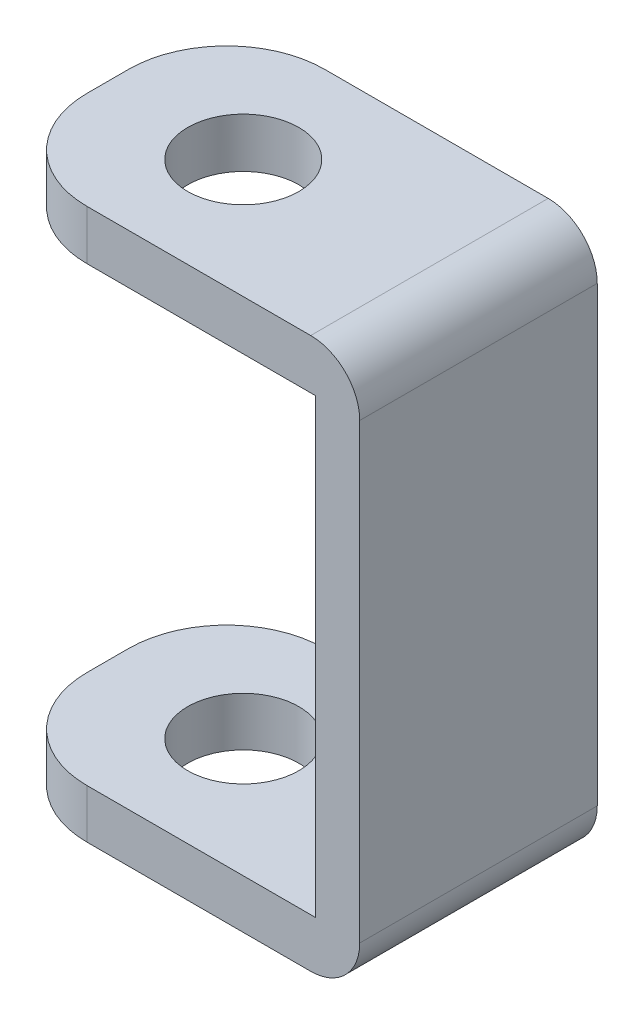
ISO-10303-21;
HEADER;
FILE_DESCRIPTION(('STEP AP214'),'2;1');
FILE_NAME('part.step','',(''),(''),'','','');
FILE_SCHEMA(('AUTOMOTIVE_DESIGN { 1 0 10303 214 1 1 1 1 }'));
ENDSEC;
DATA;
#1=APPLICATION_CONTEXT('core data for automotive mechanical design processes');
#2=APPLICATION_PROTOCOL_DEFINITION('international standard','automotive_design',2000,#1);
#3=PRODUCT_CONTEXT('',#1,'mechanical');
#4=PRODUCT('Part','Part','',(#3));
#5=PRODUCT_RELATED_PRODUCT_CATEGORY('part','',(#4));
#6=PRODUCT_DEFINITION_FORMATION('','',#4);
#7=PRODUCT_DEFINITION_CONTEXT('part definition',#1,'design');
#8=PRODUCT_DEFINITION('design','',#6,#7);
#9=PRODUCT_DEFINITION_SHAPE('','',#8);
#10=(LENGTH_UNIT() NAMED_UNIT(*) SI_UNIT(.MILLI.,.METRE.));
#11=(NAMED_UNIT(*) PLANE_ANGLE_UNIT() SI_UNIT($,.RADIAN.));
#12=(NAMED_UNIT(*) SI_UNIT($,.STERADIAN.) SOLID_ANGLE_UNIT());
#13=UNCERTAINTY_MEASURE_WITH_UNIT(LENGTH_MEASURE(1.E-05),#10,'distance_accuracy_value','');
#14=(GEOMETRIC_REPRESENTATION_CONTEXT(3) GLOBAL_UNCERTAINTY_ASSIGNED_CONTEXT((#13)) GLOBAL_UNIT_ASSIGNED_CONTEXT((#10,
#11,#12)) REPRESENTATION_CONTEXT('',''));
#15=CARTESIAN_POINT('',(0.,0.,0.));
#16=DIRECTION('',(0.,0.,1.));
#17=DIRECTION('',(1.,0.,0.));
#18=AXIS2_PLACEMENT_3D('',#15,#16,#17);
#19=CARTESIAN_POINT('',(-0.121305042169645,78.59,0.));
#20=DIRECTION('',(-1.,0.,0.));
#21=DIRECTION('',(0.,0.,1.));
#22=AXIS2_PLACEMENT_3D('',#19,#20,#21);
#23=PLANE('',#22);
#24=DIRECTION('',(0.,-1.,0.));
#25=VECTOR('',#24,1.);
#26=CARTESIAN_POINT('',(-0.121305042169645,78.59,-14.0000000000001));
#27=LINE('',#26,#25);
#28=CARTESIAN_POINT('',(-0.121305042169645,7.00000000000001,-14.0000000000001));
#29=VERTEX_POINT('',#28);
#30=CARTESIAN_POINT('',(-0.121305042169645,0.,-14.0000000000001));
#31=VERTEX_POINT('',#30);
#32=EDGE_CURVE('E236',#29,#31,#27,.T.);
#33=ORIENTED_EDGE('',*,*,#32,.F.);
#34=DIRECTION('',(0.,0.,-1.));
#35=VECTOR('',#34,1.);
#36=CARTESIAN_POINT('',(-0.121305042169645,7.00000000000001,0.));
#37=LINE('',#36,#35);
#38=CARTESIAN_POINT('',(-0.121305042169643,7.00000000000001,-19.8999999999999));
#39=VERTEX_POINT('',#38);
#40=EDGE_CURVE('E179',#29,#39,#37,.T.);
#41=ORIENTED_EDGE('',*,*,#40,.T.);
#42=DIRECTION('',(0.,-1.,0.));
#43=VECTOR('',#42,1.);
#44=CARTESIAN_POINT('',(-0.121305042169645,78.59,-19.8999999999999));
#45=LINE('',#44,#43);
#46=CARTESIAN_POINT('',(-0.121305042169645,0.,-19.8999999999999));
#47=VERTEX_POINT('',#46);
#48=EDGE_CURVE('E206',#39,#47,#45,.T.);
#49=ORIENTED_EDGE('',*,*,#48,.T.);
#50=DIRECTION('',(0.,0.,-1.));
#51=VECTOR('',#50,1.);
#52=CARTESIAN_POINT('',(-0.121305042169645,0.,0.));
#53=LINE('',#52,#51);
#54=EDGE_CURVE('E209',#31,#47,#53,.T.);
#55=ORIENTED_EDGE('',*,*,#54,.F.);
#56=EDGE_LOOP('',(#33,#41,#49,#55));
#57=FACE_BOUND('',#56,.T.);
#58=ADVANCED_FACE('F38',(#57),#23,.T.);
#59=CARTESIAN_POINT('',(-0.121305042169645,78.59,-19.8999999999999));
#60=VERTEX_POINT('',#59);
#61=CARTESIAN_POINT('',(-0.121305042169645,71.5001545213383,-19.8999999999999));
#62=VERTEX_POINT('',#61);
#63=EDGE_CURVE('E222',#60,#62,#45,.T.);
#64=ORIENTED_EDGE('',*,*,#63,.T.);
#65=DIRECTION('',(0.,0.,1.));
#66=VECTOR('',#65,1.);
#67=CARTESIAN_POINT('',(-0.121305042169645,71.5001545213383,0.));
#68=LINE('',#67,#66);
#69=CARTESIAN_POINT('',(-0.121305042169645,71.5001545213383,-14.0000000000001));
#70=VERTEX_POINT('',#69);
#71=EDGE_CURVE('E169',#62,#70,#68,.T.);
#72=ORIENTED_EDGE('',*,*,#71,.T.);
#73=CARTESIAN_POINT('',(-0.121305042169645,78.59,-14.0000000000001));
#74=VERTEX_POINT('',#73);
#75=EDGE_CURVE('E237',#74,#70,#27,.T.);
#76=ORIENTED_EDGE('',*,*,#75,.F.);
#77=DIRECTION('',(0.,0.,-1.));
#78=VECTOR('',#77,1.);
#79=CARTESIAN_POINT('',(-0.121305042169645,78.59,0.));
#80=LINE('',#79,#78);
#81=EDGE_CURVE('E190',#74,#60,#80,.T.);
#82=ORIENTED_EDGE('',*,*,#81,.T.);
#83=EDGE_LOOP('',(#64,#72,#76,#82));
#84=FACE_BOUND('',#83,.T.);
#85=ADVANCED_FACE('F286',(#84),#23,.T.);
#86=CARTESIAN_POINT('',(13.8786949578304,78.59,-14.));
#87=DIRECTION('',(0.,-1.,0.));
#88=DIRECTION('',(0.,0.,-1.));
#89=AXIS2_PLACEMENT_3D('',#86,#87,#88);
#90=CYLINDRICAL_SURFACE('',#89,14.);
#91=CARTESIAN_POINT('',(13.8786949578304,7.00000000000001,-14.));
#92=DIRECTION('',(0.,1.,0.));
#93=DIRECTION('',(0.,0.,1.));
#94=AXIS2_PLACEMENT_3D('',#91,#92,#93);
#95=CIRCLE('',#94,14.);
#96=CARTESIAN_POINT('',(13.8786949578305,7.00000000000001,0.));
#97=VERTEX_POINT('',#96);
#98=EDGE_CURVE('E157',#29,#97,#95,.T.);
#99=ORIENTED_EDGE('',*,*,#98,.F.);
#100=ORIENTED_EDGE('',*,*,#32,.T.);
#101=CARTESIAN_POINT('',(13.8786949578304,0.,-14.));
#102=DIRECTION('',(0.,1.,0.));
#103=DIRECTION('',(0.,0.,1.));
#104=AXIS2_PLACEMENT_3D('',#101,#102,#103);
#105=CIRCLE('',#104,14.);
#106=CARTESIAN_POINT('',(13.8786949578305,0.,0.));
#107=VERTEX_POINT('',#106);
#108=EDGE_CURVE('E212',#31,#107,#105,.T.);
#109=ORIENTED_EDGE('',*,*,#108,.T.);
#110=DIRECTION('',(0.,-1.,0.));
#111=VECTOR('',#110,1.);
#112=CARTESIAN_POINT('',(13.8786949578305,78.59,0.));
#113=LINE('',#112,#111);
#114=EDGE_CURVE('E233',#97,#107,#113,.T.);
#115=ORIENTED_EDGE('',*,*,#114,.F.);
#116=EDGE_LOOP('',(#99,#100,#109,#115));
#117=FACE_BOUND('',#116,.T.);
#118=ADVANCED_FACE('F268',(#117),#90,.T.);
#119=CARTESIAN_POINT('',(13.8786949578304,71.5001545213383,-14.));
#120=DIRECTION('',(0.,-1.,0.));
#121=DIRECTION('',(0.,0.,-1.));
#122=AXIS2_PLACEMENT_3D('',#119,#120,#121);
#123=CIRCLE('',#122,14.);
#124=CARTESIAN_POINT('',(13.8786949578305,71.5001545213383,0.));
#125=VERTEX_POINT('',#124);
#126=EDGE_CURVE('E172',#125,#70,#123,.T.);
#127=ORIENTED_EDGE('',*,*,#126,.F.);
#128=CARTESIAN_POINT('',(13.8786949578305,78.59,0.));
#129=VERTEX_POINT('',#128);
#130=EDGE_CURVE('E234',#129,#125,#113,.T.);
#131=ORIENTED_EDGE('',*,*,#130,.F.);
#132=CARTESIAN_POINT('',(13.8786949578304,78.59,-14.));
#133=DIRECTION('',(0.,1.,0.));
#134=DIRECTION('',(0.,0.,1.));
#135=AXIS2_PLACEMENT_3D('',#132,#133,#134);
#136=CIRCLE('',#135,14.);
#137=EDGE_CURVE('E194',#74,#129,#136,.T.);
#138=ORIENTED_EDGE('',*,*,#137,.F.);
#139=ORIENTED_EDGE('',*,*,#75,.T.);
#140=EDGE_LOOP('',(#127,#131,#138,#139));
#141=FACE_BOUND('',#140,.T.);
#142=ADVANCED_FACE('F323',(#141),#90,.T.);
#143=CARTESIAN_POINT('',(0.,78.59,0.));
#144=DIRECTION('',(0.,0.,-1.));
#145=DIRECTION('',(-1.,0.,0.));
#146=AXIS2_PLACEMENT_3D('',#143,#144,#145);
#147=PLANE('',#146);
#148=DIRECTION('',(1.,0.,0.));
#149=VECTOR('',#148,1.);
#150=CARTESIAN_POINT('',(0.,0.,0.));
#151=LINE('',#150,#149);
#152=CARTESIAN_POINT('',(45.7786949578304,0.,0.));
#153=VERTEX_POINT('',#152);
#154=EDGE_CURVE('E215',#107,#153,#151,.T.);
#155=ORIENTED_EDGE('',*,*,#154,.T.);
#156=CARTESIAN_POINT('',(45.7786949578304,7.,0.));
#157=DIRECTION('',(0.,0.,-1.));
#158=DIRECTION('',(-1.,0.,0.));
#159=AXIS2_PLACEMENT_3D('',#156,#157,#158);
#160=CIRCLE('',#159,7.);
#161=CARTESIAN_POINT('',(52.7786949578304,7.00000000000001,0.));
#162=VERTEX_POINT('',#161);
#163=EDGE_CURVE('E60',#153,#162,#160,.F.);
#164=ORIENTED_EDGE('',*,*,#163,.T.);
#165=DIRECTION('',(0.,-1.,0.));
#166=VECTOR('',#165,1.);
#167=CARTESIAN_POINT('',(52.7786949578304,78.59,0.));
#168=LINE('',#167,#166);
#169=CARTESIAN_POINT('',(52.7786949578304,71.59,0.));
#170=VERTEX_POINT('',#169);
#171=EDGE_CURVE('E231',#170,#162,#168,.T.);
#172=ORIENTED_EDGE('',*,*,#171,.F.);
#173=CARTESIAN_POINT('',(45.7786949578304,71.59,0.));
#174=DIRECTION('',(0.,0.,-1.));
#175=DIRECTION('',(-1.,0.,0.));
#176=AXIS2_PLACEMENT_3D('',#173,#174,#175);
#177=CIRCLE('',#176,7.);
#178=CARTESIAN_POINT('',(45.7786949578304,78.59,0.));
#179=VERTEX_POINT('',#178);
#180=EDGE_CURVE('E243',#170,#179,#177,.F.);
#181=ORIENTED_EDGE('',*,*,#180,.T.);
#182=DIRECTION('',(1.,0.,0.));
#183=VECTOR('',#182,1.);
#184=CARTESIAN_POINT('',(0.,78.59,0.));
#185=LINE('',#184,#183);
#186=EDGE_CURVE('E197',#129,#179,#185,.T.);
#187=ORIENTED_EDGE('',*,*,#186,.F.);
#188=ORIENTED_EDGE('',*,*,#130,.T.);
#189=DIRECTION('',(1.,0.,0.));
#190=VECTOR('',#189,1.);
#191=CARTESIAN_POINT('',(0.,71.5001545213383,0.));
#192=LINE('',#191,#190);
#193=CARTESIAN_POINT('',(46.4454980749878,71.5001545213383,0.));
#194=VERTEX_POINT('',#193);
#195=EDGE_CURVE('E151',#125,#194,#192,.T.);
#196=ORIENTED_EDGE('',*,*,#195,.T.);
#197=DIRECTION('',(0.,-1.,0.));
#198=VECTOR('',#197,1.);
#199=CARTESIAN_POINT('',(46.4454980749878,0.,0.));
#200=LINE('',#199,#198);
#201=CARTESIAN_POINT('',(46.4454980749878,7.00000000000001,0.));
#202=VERTEX_POINT('',#201);
#203=EDGE_CURVE('E144',#194,#202,#200,.T.);
#204=ORIENTED_EDGE('',*,*,#203,.T.);
#205=DIRECTION('',(-1.,0.,0.));
#206=VECTOR('',#205,1.);
#207=CARTESIAN_POINT('',(0.,7.00000000000001,0.));
#208=LINE('',#207,#206);
#209=EDGE_CURVE('E154',#202,#97,#208,.T.);
#210=ORIENTED_EDGE('',*,*,#209,.T.);
#211=ORIENTED_EDGE('',*,*,#114,.T.);
#212=EDGE_LOOP('',(#155,#164,#172,#181,#187,#188,#196,#204,#210,#211));
#213=FACE_BOUND('',#212,.T.);
#214=ADVANCED_FACE('F160',(#213),#147,.F.);
#215=CARTESIAN_POINT('',(0.,78.59,-33.9));
#216=DIRECTION('',(0.,0.,-1.));
#217=DIRECTION('',(-1.,0.,0.));
#218=AXIS2_PLACEMENT_3D('',#215,#216,#217);
#219=PLANE('',#218);
#220=DIRECTION('',(0.,-1.,0.));
#221=VECTOR('',#220,1.);
#222=CARTESIAN_POINT('',(52.7786949578304,78.59,-33.9));
#223=LINE('',#222,#221);
#224=CARTESIAN_POINT('',(52.7786949578304,71.59,-33.9));
#225=VERTEX_POINT('',#224);
#226=CARTESIAN_POINT('',(52.7786949578304,7.00000000000001,-33.9));
#227=VERTEX_POINT('',#226);
#228=EDGE_CURVE('E229',#225,#227,#223,.T.);
#229=ORIENTED_EDGE('',*,*,#228,.T.);
#230=CARTESIAN_POINT('',(45.7786949578304,7.,-33.9));
#231=DIRECTION('',(0.,0.,-1.));
#232=DIRECTION('',(-1.,0.,0.));
#233=AXIS2_PLACEMENT_3D('',#230,#231,#232);
#234=CIRCLE('',#233,7.);
#235=CARTESIAN_POINT('',(45.7786949578304,0.,-33.9));
#236=VERTEX_POINT('',#235);
#237=EDGE_CURVE('E11',#227,#236,#234,.T.);
#238=ORIENTED_EDGE('',*,*,#237,.T.);
#239=DIRECTION('',(1.,0.,0.));
#240=VECTOR('',#239,1.);
#241=CARTESIAN_POINT('',(0.,0.,-33.9));
#242=LINE('',#241,#240);
#243=CARTESIAN_POINT('',(13.8786949578305,0.,-33.9));
#244=VERTEX_POINT('',#243);
#245=EDGE_CURVE('E217',#244,#236,#242,.T.);
#246=ORIENTED_EDGE('',*,*,#245,.F.);
#247=DIRECTION('',(0.,-1.,0.));
#248=VECTOR('',#247,1.);
#249=CARTESIAN_POINT('',(13.8786949578305,78.59,-33.9));
#250=LINE('',#249,#248);
#251=CARTESIAN_POINT('',(13.8786949578305,7.00000000000001,-33.9));
#252=VERTEX_POINT('',#251);
#253=EDGE_CURVE('E225',#252,#244,#250,.T.);
#254=ORIENTED_EDGE('',*,*,#253,.F.);
#255=DIRECTION('',(1.,0.,0.));
#256=VECTOR('',#255,1.);
#257=CARTESIAN_POINT('',(0.,7.00000000000001,-33.9));
#258=LINE('',#257,#256);
#259=CARTESIAN_POINT('',(46.4454980749878,7.00000000000001,-33.9));
#260=VERTEX_POINT('',#259);
#261=EDGE_CURVE('E177',#252,#260,#258,.T.);
#262=ORIENTED_EDGE('',*,*,#261,.T.);
#263=DIRECTION('',(0.,1.,0.));
#264=VECTOR('',#263,1.);
#265=CARTESIAN_POINT('',(46.4454980749878,78.59,-33.9));
#266=LINE('',#265,#264);
#267=CARTESIAN_POINT('',(46.4454980749878,71.5001545213383,-33.9));
#268=VERTEX_POINT('',#267);
#269=EDGE_CURVE('E147',#260,#268,#266,.T.);
#270=ORIENTED_EDGE('',*,*,#269,.T.);
#271=DIRECTION('',(-1.,0.,0.));
#272=VECTOR('',#271,1.);
#273=CARTESIAN_POINT('',(0.,71.5001545213383,-33.9));
#274=LINE('',#273,#272);
#275=CARTESIAN_POINT('',(13.8786949578304,71.5001545213383,-33.9));
#276=VERTEX_POINT('',#275);
#277=EDGE_CURVE('E165',#268,#276,#274,.T.);
#278=ORIENTED_EDGE('',*,*,#277,.T.);
#279=CARTESIAN_POINT('',(13.8786949578305,78.59,-33.9));
#280=VERTEX_POINT('',#279);
#281=EDGE_CURVE('E226',#280,#276,#250,.T.);
#282=ORIENTED_EDGE('',*,*,#281,.F.);
#283=DIRECTION('',(1.,0.,0.));
#284=VECTOR('',#283,1.);
#285=CARTESIAN_POINT('',(0.,78.59,-33.9));
#286=LINE('',#285,#284);
#287=CARTESIAN_POINT('',(45.7786949578304,78.59,-33.9));
#288=VERTEX_POINT('',#287);
#289=EDGE_CURVE('E200',#280,#288,#286,.T.);
#290=ORIENTED_EDGE('',*,*,#289,.T.);
#291=CARTESIAN_POINT('',(45.7786949578304,71.59,-33.9));
#292=DIRECTION('',(0.,0.,-1.));
#293=DIRECTION('',(-1.,0.,0.));
#294=AXIS2_PLACEMENT_3D('',#291,#292,#293);
#295=CIRCLE('',#294,7.);
#296=EDGE_CURVE('E247',#288,#225,#295,.T.);
#297=ORIENTED_EDGE('',*,*,#296,.T.);
#298=EDGE_LOOP('',(#229,#238,#246,#254,#262,#270,#278,#282,#290,#297));
#299=FACE_BOUND('',#298,.T.);
#300=ADVANCED_FACE('F278',(#299),#219,.T.);
#301=CARTESIAN_POINT('',(19.2056870648516,78.59,-16.95));
#302=DIRECTION('',(0.,-1.,0.));
#303=DIRECTION('',(0.,0.,-1.));
#304=AXIS2_PLACEMENT_3D('',#301,#302,#303);
#305=CYLINDRICAL_SURFACE('',#304,7.93);
#306=CARTESIAN_POINT('',(19.2056870648516,0.,-16.95));
#307=DIRECTION('',(0.,1.,0.));
#308=DIRECTION('',(0.,0.,1.));
#309=AXIS2_PLACEMENT_3D('',#306,#307,#308);
#310=CIRCLE('',#309,7.93);
#311=CARTESIAN_POINT('',(19.2056870648516,0.,-9.02));
#312=VERTEX_POINT('',#311);
#313=EDGE_CURVE('E186',#312,#312,#310,.T.);
#314=ORIENTED_EDGE('',*,*,#313,.F.);
#315=EDGE_LOOP('',(#314));
#316=FACE_BOUND('',#315,.T.);
#317=CARTESIAN_POINT('',(19.2056870648516,7.00000000000001,-16.95));
#318=DIRECTION('',(0.,1.,0.));
#319=DIRECTION('',(0.,0.,1.));
#320=AXIS2_PLACEMENT_3D('',#317,#318,#319);
#321=CIRCLE('',#320,7.93);
#322=CARTESIAN_POINT('',(19.2056870648516,7.00000000000001,-9.02));
#323=VERTEX_POINT('',#322);
#324=EDGE_CURVE('E183',#323,#323,#321,.T.);
#325=ORIENTED_EDGE('',*,*,#324,.T.);
#326=EDGE_LOOP('',(#325));
#327=FACE_BOUND('',#326,.T.);
#328=ADVANCED_FACE('F295',(#316,#327),#305,.F.);
#329=CARTESIAN_POINT('',(19.2056870648516,78.59,-16.95));
#330=DIRECTION('',(0.,1.,0.));
#331=DIRECTION('',(0.,0.,1.));
#332=AXIS2_PLACEMENT_3D('',#329,#330,#331);
#333=CIRCLE('',#332,7.93);
#334=CARTESIAN_POINT('',(19.2056870648516,78.59,-9.02));
#335=VERTEX_POINT('',#334);
#336=EDGE_CURVE('E187',#335,#335,#333,.T.);
#337=ORIENTED_EDGE('',*,*,#336,.T.);
#338=EDGE_LOOP('',(#337));
#339=FACE_BOUND('',#338,.T.);
#340=CARTESIAN_POINT('',(19.2056870648516,71.5001545213383,-16.95));
#341=DIRECTION('',(0.,-1.,0.));
#342=DIRECTION('',(0.,0.,-1.));
#343=AXIS2_PLACEMENT_3D('',#340,#341,#342);
#344=CIRCLE('',#343,7.93);
#345=CARTESIAN_POINT('',(19.2056870648516,71.5001545213383,-24.88));
#346=VERTEX_POINT('',#345);
#347=EDGE_CURVE('E174',#346,#346,#344,.T.);
#348=ORIENTED_EDGE('',*,*,#347,.T.);
#349=EDGE_LOOP('',(#348));
#350=FACE_BOUND('',#349,.T.);
#351=ADVANCED_FACE('F297',(#339,#350),#305,.F.);
#352=CARTESIAN_POINT('',(13.8786949578304,78.59,-19.9));
#353=DIRECTION('',(0.,-1.,0.));
#354=DIRECTION('',(0.,0.,-1.));
#355=AXIS2_PLACEMENT_3D('',#352,#353,#354);
#356=CYLINDRICAL_SURFACE('',#355,14.);
#357=ORIENTED_EDGE('',*,*,#48,.F.);
#358=CARTESIAN_POINT('',(13.8786949578304,7.00000000000001,-19.9));
#359=DIRECTION('',(0.,1.,0.));
#360=DIRECTION('',(0.,0.,1.));
#361=AXIS2_PLACEMENT_3D('',#358,#359,#360);
#362=CIRCLE('',#361,14.);
#363=EDGE_CURVE('E252',#39,#252,#362,.F.);
#364=ORIENTED_EDGE('',*,*,#363,.T.);
#365=ORIENTED_EDGE('',*,*,#253,.T.);
#366=CARTESIAN_POINT('',(13.8786949578304,0.,-19.9));
#367=DIRECTION('',(0.,1.,0.));
#368=DIRECTION('',(0.,0.,1.));
#369=AXIS2_PLACEMENT_3D('',#366,#367,#368);
#370=CIRCLE('',#369,14.);
#371=EDGE_CURVE('E191',#47,#244,#370,.F.);
#372=ORIENTED_EDGE('',*,*,#371,.F.);
#373=EDGE_LOOP('',(#357,#364,#365,#372));
#374=FACE_BOUND('',#373,.T.);
#375=ADVANCED_FACE('F275',(#374),#356,.T.);
#376=ORIENTED_EDGE('',*,*,#281,.T.);
#377=CARTESIAN_POINT('',(13.8786949578304,71.5001545213383,-19.9));
#378=DIRECTION('',(0.,-1.,0.));
#379=DIRECTION('',(0.,0.,-1.));
#380=AXIS2_PLACEMENT_3D('',#377,#378,#379);
#381=CIRCLE('',#380,14.);
#382=EDGE_CURVE('E249',#276,#62,#381,.F.);
#383=ORIENTED_EDGE('',*,*,#382,.T.);
#384=ORIENTED_EDGE('',*,*,#63,.F.);
#385=CARTESIAN_POINT('',(13.8786949578304,78.59,-19.9));
#386=DIRECTION('',(0.,1.,0.));
#387=DIRECTION('',(0.,0.,1.));
#388=AXIS2_PLACEMENT_3D('',#385,#386,#387);
#389=CIRCLE('',#388,14.);
#390=EDGE_CURVE('E203',#60,#280,#389,.F.);
#391=ORIENTED_EDGE('',*,*,#390,.T.);
#392=EDGE_LOOP('',(#376,#383,#384,#391));
#393=FACE_BOUND('',#392,.T.);
#394=ADVANCED_FACE('F326',(#393),#356,.T.);
#395=CARTESIAN_POINT('',(52.7786949578304,78.59,0.));
#396=DIRECTION('',(1.,0.,0.));
#397=DIRECTION('',(0.,0.,-1.));
#398=AXIS2_PLACEMENT_3D('',#395,#396,#397);
#399=PLANE('',#398);
#400=ORIENTED_EDGE('',*,*,#171,.T.);
#401=DIRECTION('',(0.,0.,1.));
#402=VECTOR('',#401,1.);
#403=CARTESIAN_POINT('',(52.7786949578304,7.,-33.9));
#404=LINE('',#403,#402);
#405=EDGE_CURVE('E46',#162,#227,#404,.F.);
#406=ORIENTED_EDGE('',*,*,#405,.T.);
#407=ORIENTED_EDGE('',*,*,#228,.F.);
#408=DIRECTION('',(0.,0.,1.));
#409=VECTOR('',#408,1.);
#410=CARTESIAN_POINT('',(52.7786949578304,71.59,0.));
#411=LINE('',#410,#409);
#412=EDGE_CURVE('E240',#225,#170,#411,.T.);
#413=ORIENTED_EDGE('',*,*,#412,.T.);
#414=EDGE_LOOP('',(#400,#406,#407,#413));
#415=FACE_BOUND('',#414,.T.);
#416=ADVANCED_FACE('F315',(#415),#399,.T.);
#417=CARTESIAN_POINT('',(0.,78.59,0.));
#418=DIRECTION('',(0.,1.,0.));
#419=DIRECTION('',(0.,0.,1.));
#420=AXIS2_PLACEMENT_3D('',#417,#418,#419);
#421=PLANE('',#420);
#422=ORIENTED_EDGE('',*,*,#336,.F.);
#423=EDGE_LOOP('',(#422));
#424=FACE_BOUND('',#423,.T.);
#425=ORIENTED_EDGE('',*,*,#186,.T.);
#426=DIRECTION('',(0.,0.,1.));
#427=VECTOR('',#426,1.);
#428=CARTESIAN_POINT('',(45.7786949578304,78.59,0.));
#429=LINE('',#428,#427);
#430=EDGE_CURVE('E245',#179,#288,#429,.F.);
#431=ORIENTED_EDGE('',*,*,#430,.T.);
#432=ORIENTED_EDGE('',*,*,#289,.F.);
#433=ORIENTED_EDGE('',*,*,#390,.F.);
#434=ORIENTED_EDGE('',*,*,#81,.F.);
#435=ORIENTED_EDGE('',*,*,#137,.T.);
#436=EDGE_LOOP('',(#425,#431,#432,#433,#434,#435));
#437=FACE_BOUND('',#436,.T.);
#438=ADVANCED_FACE('F308',(#424,#437),#421,.T.);
#439=CARTESIAN_POINT('',(0.,0.,0.));
#440=DIRECTION('',(0.,1.,0.));
#441=DIRECTION('',(0.,0.,1.));
#442=AXIS2_PLACEMENT_3D('',#439,#440,#441);
#443=PLANE('',#442);
#444=ORIENTED_EDGE('',*,*,#313,.T.);
#445=EDGE_LOOP('',(#444));
#446=FACE_BOUND('',#445,.T.);
#447=ORIENTED_EDGE('',*,*,#245,.T.);
#448=DIRECTION('',(0.,0.,1.));
#449=VECTOR('',#448,1.);
#450=CARTESIAN_POINT('',(45.7786949578304,0.,0.));
#451=LINE('',#450,#449);
#452=EDGE_CURVE('E256',#236,#153,#451,.T.);
#453=ORIENTED_EDGE('',*,*,#452,.T.);
#454=ORIENTED_EDGE('',*,*,#154,.F.);
#455=ORIENTED_EDGE('',*,*,#108,.F.);
#456=ORIENTED_EDGE('',*,*,#54,.T.);
#457=ORIENTED_EDGE('',*,*,#371,.T.);
#458=EDGE_LOOP('',(#447,#453,#454,#455,#456,#457));
#459=FACE_BOUND('',#458,.T.);
#460=ADVANCED_FACE('F262',(#446,#459),#443,.F.);
#461=CARTESIAN_POINT('',(45.7786949578304,71.59,0.));
#462=DIRECTION('',(0.,0.,1.));
#463=DIRECTION('',(1.,0.,0.));
#464=AXIS2_PLACEMENT_3D('',#461,#462,#463);
#465=CYLINDRICAL_SURFACE('',#464,7.);
#466=ORIENTED_EDGE('',*,*,#296,.F.);
#467=ORIENTED_EDGE('',*,*,#430,.F.);
#468=ORIENTED_EDGE('',*,*,#180,.F.);
#469=ORIENTED_EDGE('',*,*,#412,.F.);
#470=EDGE_LOOP('',(#466,#467,#468,#469));
#471=FACE_BOUND('',#470,.T.);
#472=ADVANCED_FACE('F299',(#471),#465,.T.);
#473=CARTESIAN_POINT('',(0.,7.00000000000001,-86.59));
#474=DIRECTION('',(0.,1.,0.));
#475=DIRECTION('',(0.,0.,1.));
#476=AXIS2_PLACEMENT_3D('',#473,#474,#475);
#477=PLANE('',#476);
#478=ORIENTED_EDGE('',*,*,#324,.F.);
#479=EDGE_LOOP('',(#478));
#480=FACE_BOUND('',#479,.T.);
#481=ORIENTED_EDGE('',*,*,#98,.T.);
#482=ORIENTED_EDGE('',*,*,#209,.F.);
#483=DIRECTION('',(0.,0.,1.));
#484=VECTOR('',#483,1.);
#485=CARTESIAN_POINT('',(46.4454980749878,7.00000000000001,-86.59));
#486=LINE('',#485,#484);
#487=EDGE_CURVE('E139',#260,#202,#486,.T.);
#488=ORIENTED_EDGE('',*,*,#487,.F.);
#489=ORIENTED_EDGE('',*,*,#261,.F.);
#490=ORIENTED_EDGE('',*,*,#363,.F.);
#491=ORIENTED_EDGE('',*,*,#40,.F.);
#492=EDGE_LOOP('',(#481,#482,#488,#489,#490,#491));
#493=FACE_BOUND('',#492,.T.);
#494=ADVANCED_FACE('F155',(#480,#493),#477,.T.);
#495=CARTESIAN_POINT('',(0.,71.5001545213383,-86.59));
#496=DIRECTION('',(0.,-1.,0.));
#497=DIRECTION('',(0.,0.,-1.));
#498=AXIS2_PLACEMENT_3D('',#495,#496,#497);
#499=PLANE('',#498);
#500=ORIENTED_EDGE('',*,*,#347,.F.);
#501=EDGE_LOOP('',(#500));
#502=FACE_BOUND('',#501,.T.);
#503=ORIENTED_EDGE('',*,*,#126,.T.);
#504=ORIENTED_EDGE('',*,*,#71,.F.);
#505=ORIENTED_EDGE('',*,*,#382,.F.);
#506=ORIENTED_EDGE('',*,*,#277,.F.);
#507=DIRECTION('',(0.,0.,1.));
#508=VECTOR('',#507,1.);
#509=CARTESIAN_POINT('',(46.4454980749878,71.5001545213383,-86.59));
#510=LINE('',#509,#508);
#511=EDGE_CURVE('E150',#268,#194,#510,.T.);
#512=ORIENTED_EDGE('',*,*,#511,.T.);
#513=ORIENTED_EDGE('',*,*,#195,.F.);
#514=EDGE_LOOP('',(#503,#504,#505,#506,#512,#513));
#515=FACE_BOUND('',#514,.T.);
#516=ADVANCED_FACE('F283',(#502,#515),#499,.T.);
#517=CARTESIAN_POINT('',(46.4454980749878,0.,-86.59));
#518=DIRECTION('',(-1.,0.,0.));
#519=DIRECTION('',(0.,0.,1.));
#520=AXIS2_PLACEMENT_3D('',#517,#518,#519);
#521=PLANE('',#520);
#522=ORIENTED_EDGE('',*,*,#487,.T.);
#523=ORIENTED_EDGE('',*,*,#203,.F.);
#524=ORIENTED_EDGE('',*,*,#511,.F.);
#525=ORIENTED_EDGE('',*,*,#269,.F.);
#526=EDGE_LOOP('',(#522,#523,#524,#525));
#527=FACE_BOUND('',#526,.T.);
#528=ADVANCED_FACE('F141',(#527),#521,.T.);
#529=CARTESIAN_POINT('',(45.7786949578304,7.,0.));
#530=DIRECTION('',(0.,0.,-1.));
#531=DIRECTION('',(-1.,0.,0.));
#532=AXIS2_PLACEMENT_3D('',#529,#530,#531);
#533=CYLINDRICAL_SURFACE('',#532,7.);
#534=ORIENTED_EDGE('',*,*,#237,.F.);
#535=ORIENTED_EDGE('',*,*,#405,.F.);
#536=ORIENTED_EDGE('',*,*,#163,.F.);
#537=ORIENTED_EDGE('',*,*,#452,.F.);
#538=EDGE_LOOP('',(#534,#535,#536,#537));
#539=FACE_BOUND('',#538,.T.);
#540=ADVANCED_FACE('F40',(#539),#533,.T.);
#541=CLOSED_SHELL('',(#58,#85,#118,#142,#214,#300,#328,#351,#375,#394,#416,#438,#460,#472,#494,
#516,#528,#540));
#542=MANIFOLD_SOLID_BREP('B2',#541);
#543=ADVANCED_BREP_SHAPE_REPRESENTATION('',(#18,#542),#14);
#544=SHAPE_DEFINITION_REPRESENTATION(#9,#543);
ENDSEC;
END-ISO-10303-21;
